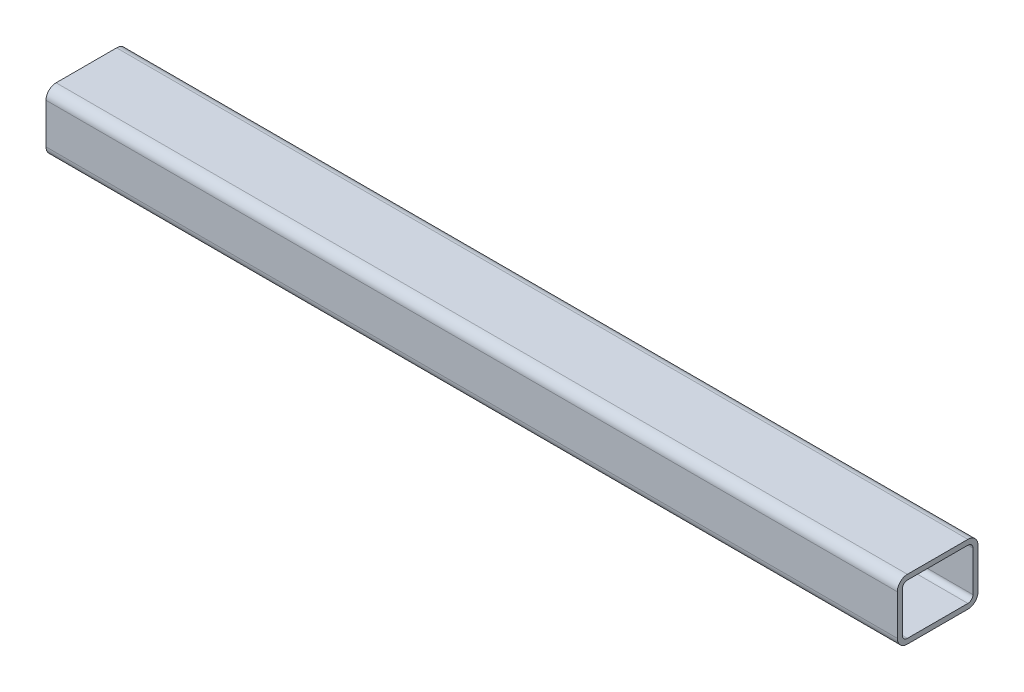
ISO-10303-21;
HEADER;
FILE_DESCRIPTION(('STEP AP214'),'2;1');
FILE_NAME('part.step','',(''),(''),'','','');
FILE_SCHEMA(('AUTOMOTIVE_DESIGN { 1 0 10303 214 1 1 1 1 }'));
ENDSEC;
DATA;
#1=APPLICATION_CONTEXT('core data for automotive mechanical design processes');
#2=APPLICATION_PROTOCOL_DEFINITION('international standard','automotive_design',2000,#1);
#3=PRODUCT_CONTEXT('',#1,'mechanical');
#4=PRODUCT('Part','Part','',(#3));
#5=PRODUCT_RELATED_PRODUCT_CATEGORY('part','',(#4));
#6=PRODUCT_DEFINITION_FORMATION('','',#4);
#7=PRODUCT_DEFINITION_CONTEXT('part definition',#1,'design');
#8=PRODUCT_DEFINITION('design','',#6,#7);
#9=PRODUCT_DEFINITION_SHAPE('','',#8);
#10=(LENGTH_UNIT() NAMED_UNIT(*) SI_UNIT(.MILLI.,.METRE.));
#11=(NAMED_UNIT(*) PLANE_ANGLE_UNIT() SI_UNIT($,.RADIAN.));
#12=(NAMED_UNIT(*) SI_UNIT($,.STERADIAN.) SOLID_ANGLE_UNIT());
#13=UNCERTAINTY_MEASURE_WITH_UNIT(LENGTH_MEASURE(1.E-05),#10,'distance_accuracy_value','');
#14=(GEOMETRIC_REPRESENTATION_CONTEXT(3) GLOBAL_UNCERTAINTY_ASSIGNED_CONTEXT((#13)) GLOBAL_UNIT_ASSIGNED_CONTEXT((#10,
#11,#12)) REPRESENTATION_CONTEXT('',''));
#15=CARTESIAN_POINT('',(0.,0.,0.));
#16=DIRECTION('',(0.,0.,1.));
#17=DIRECTION('',(1.,0.,0.));
#18=AXIS2_PLACEMENT_3D('',#15,#16,#17);
#19=CARTESIAN_POINT('',(422.,-20.,30.));
#20=DIRECTION('',(1.,0.,0.));
#21=DIRECTION('',(0.,0.,-1.));
#22=AXIS2_PLACEMENT_3D('',#19,#20,#21);
#23=PLANE('',#22);
#24=CARTESIAN_POINT('',(422.,-20.,30.));
#25=DIRECTION('',(1.,0.,0.));
#26=DIRECTION('',(0.,0.,-1.));
#27=AXIS2_PLACEMENT_3D('',#24,#25,#26);
#28=CIRCLE('',#27,10.);
#29=CARTESIAN_POINT('',(422.,-20.,40.));
#30=VERTEX_POINT('',#29);
#31=CARTESIAN_POINT('',(422.,-30.,30.));
#32=VERTEX_POINT('',#31);
#33=EDGE_CURVE('E212',#30,#32,#28,.T.);
#34=ORIENTED_EDGE('',*,*,#33,.T.);
#35=DIRECTION('',(0.,0.,-1.));
#36=VECTOR('',#35,1.);
#37=CARTESIAN_POINT('',(422.,-30.,30.));
#38=LINE('',#37,#36);
#39=CARTESIAN_POINT('',(422.,-30.,-30.));
#40=VERTEX_POINT('',#39);
#41=EDGE_CURVE('E215',#32,#40,#38,.T.);
#42=ORIENTED_EDGE('',*,*,#41,.T.);
#43=CARTESIAN_POINT('',(422.,-20.,-30.));
#44=DIRECTION('',(1.,0.,0.));
#45=DIRECTION('',(0.,0.,-1.));
#46=AXIS2_PLACEMENT_3D('',#43,#44,#45);
#47=CIRCLE('',#46,10.);
#48=CARTESIAN_POINT('',(422.,-20.,-40.));
#49=VERTEX_POINT('',#48);
#50=EDGE_CURVE('E218',#40,#49,#47,.T.);
#51=ORIENTED_EDGE('',*,*,#50,.T.);
#52=DIRECTION('',(0.,1.,0.));
#53=VECTOR('',#52,1.);
#54=CARTESIAN_POINT('',(422.,20.,-40.));
#55=LINE('',#54,#53);
#56=CARTESIAN_POINT('',(422.,20.,-40.));
#57=VERTEX_POINT('',#56);
#58=EDGE_CURVE('E220',#49,#57,#55,.T.);
#59=ORIENTED_EDGE('',*,*,#58,.T.);
#60=CARTESIAN_POINT('',(422.,20.,-30.));
#61=DIRECTION('',(1.,0.,0.));
#62=DIRECTION('',(0.,0.,1.));
#63=AXIS2_PLACEMENT_3D('',#60,#61,#62);
#64=CIRCLE('',#63,10.);
#65=CARTESIAN_POINT('',(422.,30.,-30.));
#66=VERTEX_POINT('',#65);
#67=EDGE_CURVE('E222',#57,#66,#64,.T.);
#68=ORIENTED_EDGE('',*,*,#67,.T.);
#69=DIRECTION('',(0.,0.,1.));
#70=VECTOR('',#69,1.);
#71=CARTESIAN_POINT('',(422.,30.,30.));
#72=LINE('',#71,#70);
#73=CARTESIAN_POINT('',(422.,30.,30.));
#74=VERTEX_POINT('',#73);
#75=EDGE_CURVE('E224',#66,#74,#72,.T.);
#76=ORIENTED_EDGE('',*,*,#75,.T.);
#77=CARTESIAN_POINT('',(422.,20.,30.));
#78=DIRECTION('',(1.,0.,0.));
#79=DIRECTION('',(0.,0.,-1.));
#80=AXIS2_PLACEMENT_3D('',#77,#78,#79);
#81=CIRCLE('',#80,10.);
#82=CARTESIAN_POINT('',(422.,20.,40.));
#83=VERTEX_POINT('',#82);
#84=EDGE_CURVE('E226',#74,#83,#81,.T.);
#85=ORIENTED_EDGE('',*,*,#84,.T.);
#86=DIRECTION('',(0.,-1.,0.));
#87=VECTOR('',#86,1.);
#88=CARTESIAN_POINT('',(422.,20.,40.));
#89=LINE('',#88,#87);
#90=EDGE_CURVE('E228',#83,#30,#89,.T.);
#91=ORIENTED_EDGE('',*,*,#90,.T.);
#92=EDGE_LOOP('',(#34,#42,#51,#59,#68,#76,#85,#91));
#93=FACE_BOUND('',#92,.T.);
#94=DIRECTION('',(0.,0.,-1.));
#95=VECTOR('',#94,1.);
#96=CARTESIAN_POINT('',(422.,-25.,30.));
#97=LINE('',#96,#95);
#98=CARTESIAN_POINT('',(422.,-25.,30.));
#99=VERTEX_POINT('',#98);
#100=CARTESIAN_POINT('',(422.,-25.,-30.));
#101=VERTEX_POINT('',#100);
#102=EDGE_CURVE('E155',#99,#101,#97,.T.);
#103=ORIENTED_EDGE('',*,*,#102,.F.);
#104=CARTESIAN_POINT('',(422.,-20.,30.));
#105=DIRECTION('',(1.,0.,0.));
#106=DIRECTION('',(0.,0.,1.));
#107=AXIS2_PLACEMENT_3D('',#104,#105,#106);
#108=CIRCLE('',#107,5.00000000000001);
#109=CARTESIAN_POINT('',(422.,-20.,35.));
#110=VERTEX_POINT('',#109);
#111=EDGE_CURVE('E147',#110,#99,#108,.T.);
#112=ORIENTED_EDGE('',*,*,#111,.F.);
#113=DIRECTION('',(0.,-1.,0.));
#114=VECTOR('',#113,1.);
#115=CARTESIAN_POINT('',(422.,20.,35.));
#116=LINE('',#115,#114);
#117=CARTESIAN_POINT('',(422.,20.,35.));
#118=VERTEX_POINT('',#117);
#119=EDGE_CURVE('E180',#118,#110,#116,.T.);
#120=ORIENTED_EDGE('',*,*,#119,.F.);
#121=CARTESIAN_POINT('',(422.,20.,30.));
#122=DIRECTION('',(1.,0.,0.));
#123=DIRECTION('',(0.,0.,-1.));
#124=AXIS2_PLACEMENT_3D('',#121,#122,#123);
#125=CIRCLE('',#124,5.);
#126=CARTESIAN_POINT('',(422.,25.,30.));
#127=VERTEX_POINT('',#126);
#128=EDGE_CURVE('E178',#127,#118,#125,.T.);
#129=ORIENTED_EDGE('',*,*,#128,.F.);
#130=DIRECTION('',(0.,0.,1.));
#131=VECTOR('',#130,1.);
#132=CARTESIAN_POINT('',(422.,25.,30.));
#133=LINE('',#132,#131);
#134=CARTESIAN_POINT('',(422.,25.,-30.));
#135=VERTEX_POINT('',#134);
#136=EDGE_CURVE('E176',#135,#127,#133,.T.);
#137=ORIENTED_EDGE('',*,*,#136,.F.);
#138=CARTESIAN_POINT('',(422.,20.,-30.));
#139=DIRECTION('',(1.,0.,0.));
#140=DIRECTION('',(0.,0.,1.));
#141=AXIS2_PLACEMENT_3D('',#138,#139,#140);
#142=CIRCLE('',#141,5.00000000000001);
#143=CARTESIAN_POINT('',(422.,20.,-35.));
#144=VERTEX_POINT('',#143);
#145=EDGE_CURVE('E174',#144,#135,#142,.T.);
#146=ORIENTED_EDGE('',*,*,#145,.F.);
#147=DIRECTION('',(0.,1.,0.));
#148=VECTOR('',#147,1.);
#149=CARTESIAN_POINT('',(422.,20.,-35.));
#150=LINE('',#149,#148);
#151=CARTESIAN_POINT('',(422.,-20.,-35.));
#152=VERTEX_POINT('',#151);
#153=EDGE_CURVE('E170',#152,#144,#150,.T.);
#154=ORIENTED_EDGE('',*,*,#153,.F.);
#155=CARTESIAN_POINT('',(422.,-20.,-30.));
#156=DIRECTION('',(1.,0.,0.));
#157=DIRECTION('',(0.,0.,1.));
#158=AXIS2_PLACEMENT_3D('',#155,#156,#157);
#159=CIRCLE('',#158,5.00000000000001);
#160=EDGE_CURVE('E168',#101,#152,#159,.T.);
#161=ORIENTED_EDGE('',*,*,#160,.F.);
#162=EDGE_LOOP('',(#103,#112,#120,#129,#137,#146,#154,#161));
#163=FACE_BOUND('',#162,.T.);
#164=ADVANCED_FACE('F34',(#93,#163),#23,.T.);
#165=CARTESIAN_POINT('',(-422.,-20.,30.));
#166=DIRECTION('',(1.,0.,0.));
#167=DIRECTION('',(0.,0.,-1.));
#168=AXIS2_PLACEMENT_3D('',#165,#166,#167);
#169=PLANE('',#168);
#170=CARTESIAN_POINT('',(-422.,-20.,30.));
#171=DIRECTION('',(1.,0.,0.));
#172=DIRECTION('',(0.,0.,-1.));
#173=AXIS2_PLACEMENT_3D('',#170,#171,#172);
#174=CIRCLE('',#173,10.);
#175=CARTESIAN_POINT('',(-422.,-20.,40.));
#176=VERTEX_POINT('',#175);
#177=CARTESIAN_POINT('',(-422.,-30.,30.));
#178=VERTEX_POINT('',#177);
#179=EDGE_CURVE('E163',#176,#178,#174,.T.);
#180=ORIENTED_EDGE('',*,*,#179,.F.);
#181=DIRECTION('',(0.,-1.,0.));
#182=VECTOR('',#181,1.);
#183=CARTESIAN_POINT('',(-422.,20.,40.));
#184=LINE('',#183,#182);
#185=CARTESIAN_POINT('',(-422.,20.,40.));
#186=VERTEX_POINT('',#185);
#187=EDGE_CURVE('E216',#186,#176,#184,.T.);
#188=ORIENTED_EDGE('',*,*,#187,.F.);
#189=CARTESIAN_POINT('',(-422.,20.,30.));
#190=DIRECTION('',(1.,0.,0.));
#191=DIRECTION('',(0.,0.,-1.));
#192=AXIS2_PLACEMENT_3D('',#189,#190,#191);
#193=CIRCLE('',#192,10.);
#194=CARTESIAN_POINT('',(-422.,30.,30.));
#195=VERTEX_POINT('',#194);
#196=EDGE_CURVE('E243',#195,#186,#193,.T.);
#197=ORIENTED_EDGE('',*,*,#196,.F.);
#198=DIRECTION('',(0.,0.,1.));
#199=VECTOR('',#198,1.);
#200=CARTESIAN_POINT('',(-422.,30.,30.));
#201=LINE('',#200,#199);
#202=CARTESIAN_POINT('',(-422.,30.,-30.));
#203=VERTEX_POINT('',#202);
#204=EDGE_CURVE('E241',#203,#195,#201,.T.);
#205=ORIENTED_EDGE('',*,*,#204,.F.);
#206=CARTESIAN_POINT('',(-422.,20.,-30.));
#207=DIRECTION('',(1.,0.,0.));
#208=DIRECTION('',(0.,0.,1.));
#209=AXIS2_PLACEMENT_3D('',#206,#207,#208);
#210=CIRCLE('',#209,10.);
#211=CARTESIAN_POINT('',(-422.,20.,-40.));
#212=VERTEX_POINT('',#211);
#213=EDGE_CURVE('E239',#212,#203,#210,.T.);
#214=ORIENTED_EDGE('',*,*,#213,.F.);
#215=DIRECTION('',(0.,1.,0.));
#216=VECTOR('',#215,1.);
#217=CARTESIAN_POINT('',(-422.,20.,-40.));
#218=LINE('',#217,#216);
#219=CARTESIAN_POINT('',(-422.,-20.,-40.));
#220=VERTEX_POINT('',#219);
#221=EDGE_CURVE('E237',#220,#212,#218,.T.);
#222=ORIENTED_EDGE('',*,*,#221,.F.);
#223=CARTESIAN_POINT('',(-422.,-20.,-30.));
#224=DIRECTION('',(1.,0.,0.));
#225=DIRECTION('',(0.,0.,-1.));
#226=AXIS2_PLACEMENT_3D('',#223,#224,#225);
#227=CIRCLE('',#226,10.);
#228=CARTESIAN_POINT('',(-422.,-30.,-30.));
#229=VERTEX_POINT('',#228);
#230=EDGE_CURVE('E235',#229,#220,#227,.T.);
#231=ORIENTED_EDGE('',*,*,#230,.F.);
#232=DIRECTION('',(0.,0.,-1.));
#233=VECTOR('',#232,1.);
#234=CARTESIAN_POINT('',(-422.,-30.,30.));
#235=LINE('',#234,#233);
#236=EDGE_CURVE('E233',#178,#229,#235,.T.);
#237=ORIENTED_EDGE('',*,*,#236,.F.);
#238=EDGE_LOOP('',(#180,#188,#197,#205,#214,#222,#231,#237));
#239=FACE_BOUND('',#238,.T.);
#240=CARTESIAN_POINT('',(-422.,-20.,30.));
#241=DIRECTION('',(1.,0.,0.));
#242=DIRECTION('',(0.,0.,1.));
#243=AXIS2_PLACEMENT_3D('',#240,#241,#242);
#244=CIRCLE('',#243,5.00000000000001);
#245=CARTESIAN_POINT('',(-422.,-20.,35.));
#246=VERTEX_POINT('',#245);
#247=CARTESIAN_POINT('',(-422.,-25.,30.));
#248=VERTEX_POINT('',#247);
#249=EDGE_CURVE('E57',#246,#248,#244,.T.);
#250=ORIENTED_EDGE('',*,*,#249,.T.);
#251=DIRECTION('',(0.,0.,-1.));
#252=VECTOR('',#251,1.);
#253=CARTESIAN_POINT('',(-422.,-25.,30.));
#254=LINE('',#253,#252);
#255=CARTESIAN_POINT('',(-422.,-25.,-30.));
#256=VERTEX_POINT('',#255);
#257=EDGE_CURVE('E162',#248,#256,#254,.T.);
#258=ORIENTED_EDGE('',*,*,#257,.T.);
#259=CARTESIAN_POINT('',(-422.,-20.,-30.));
#260=DIRECTION('',(1.,0.,0.));
#261=DIRECTION('',(0.,0.,1.));
#262=AXIS2_PLACEMENT_3D('',#259,#260,#261);
#263=CIRCLE('',#262,5.00000000000001);
#264=CARTESIAN_POINT('',(-422.,-20.,-35.));
#265=VERTEX_POINT('',#264);
#266=EDGE_CURVE('E184',#256,#265,#263,.T.);
#267=ORIENTED_EDGE('',*,*,#266,.T.);
#268=DIRECTION('',(0.,1.,0.));
#269=VECTOR('',#268,1.);
#270=CARTESIAN_POINT('',(-422.,20.,-35.));
#271=LINE('',#270,#269);
#272=CARTESIAN_POINT('',(-422.,20.,-35.));
#273=VERTEX_POINT('',#272);
#274=EDGE_CURVE('E187',#265,#273,#271,.T.);
#275=ORIENTED_EDGE('',*,*,#274,.T.);
#276=CARTESIAN_POINT('',(-422.,20.,-30.));
#277=DIRECTION('',(1.,0.,0.));
#278=DIRECTION('',(0.,0.,1.));
#279=AXIS2_PLACEMENT_3D('',#276,#277,#278);
#280=CIRCLE('',#279,5.00000000000001);
#281=CARTESIAN_POINT('',(-422.,25.,-30.));
#282=VERTEX_POINT('',#281);
#283=EDGE_CURVE('E190',#273,#282,#280,.T.);
#284=ORIENTED_EDGE('',*,*,#283,.T.);
#285=DIRECTION('',(0.,0.,1.));
#286=VECTOR('',#285,1.);
#287=CARTESIAN_POINT('',(-422.,25.,30.));
#288=LINE('',#287,#286);
#289=CARTESIAN_POINT('',(-422.,25.,30.));
#290=VERTEX_POINT('',#289);
#291=EDGE_CURVE('E193',#282,#290,#288,.T.);
#292=ORIENTED_EDGE('',*,*,#291,.T.);
#293=CARTESIAN_POINT('',(-422.,20.,30.));
#294=DIRECTION('',(1.,0.,0.));
#295=DIRECTION('',(0.,0.,-1.));
#296=AXIS2_PLACEMENT_3D('',#293,#294,#295);
#297=CIRCLE('',#296,5.);
#298=CARTESIAN_POINT('',(-422.,20.,35.));
#299=VERTEX_POINT('',#298);
#300=EDGE_CURVE('E196',#290,#299,#297,.T.);
#301=ORIENTED_EDGE('',*,*,#300,.T.);
#302=DIRECTION('',(0.,-1.,0.));
#303=VECTOR('',#302,1.);
#304=CARTESIAN_POINT('',(-422.,20.,35.));
#305=LINE('',#304,#303);
#306=EDGE_CURVE('E156',#299,#246,#305,.T.);
#307=ORIENTED_EDGE('',*,*,#306,.T.);
#308=EDGE_LOOP('',(#250,#258,#267,#275,#284,#292,#301,#307));
#309=FACE_BOUND('',#308,.T.);
#310=ADVANCED_FACE('F273',(#239,#309),#169,.F.);
#311=CARTESIAN_POINT('',(422.,-20.,30.));
#312=DIRECTION('',(-1.,0.,0.));
#313=DIRECTION('',(0.,0.,1.));
#314=AXIS2_PLACEMENT_3D('',#311,#312,#313);
#315=CYLINDRICAL_SURFACE('',#314,10.);
#316=ORIENTED_EDGE('',*,*,#179,.T.);
#317=DIRECTION('',(-1.,0.,0.));
#318=VECTOR('',#317,1.);
#319=CARTESIAN_POINT('',(422.,-30.,30.));
#320=LINE('',#319,#318);
#321=EDGE_CURVE('E11',#32,#178,#320,.T.);
#322=ORIENTED_EDGE('',*,*,#321,.F.);
#323=ORIENTED_EDGE('',*,*,#33,.F.);
#324=DIRECTION('',(-1.,0.,0.));
#325=VECTOR('',#324,1.);
#326=CARTESIAN_POINT('',(422.,-20.,40.));
#327=LINE('',#326,#325);
#328=EDGE_CURVE('E230',#30,#176,#327,.T.);
#329=ORIENTED_EDGE('',*,*,#328,.T.);
#330=EDGE_LOOP('',(#316,#322,#323,#329));
#331=FACE_BOUND('',#330,.T.);
#332=ADVANCED_FACE('F36',(#331),#315,.T.);
#333=CARTESIAN_POINT('',(422.,-30.,30.));
#334=DIRECTION('',(0.,1.,0.));
#335=DIRECTION('',(0.,0.,1.));
#336=AXIS2_PLACEMENT_3D('',#333,#334,#335);
#337=PLANE('',#336);
#338=ORIENTED_EDGE('',*,*,#236,.T.);
#339=DIRECTION('',(-1.,0.,0.));
#340=VECTOR('',#339,1.);
#341=CARTESIAN_POINT('',(422.,-30.,-30.));
#342=LINE('',#341,#340);
#343=EDGE_CURVE('E42',#40,#229,#342,.T.);
#344=ORIENTED_EDGE('',*,*,#343,.F.);
#345=ORIENTED_EDGE('',*,*,#41,.F.);
#346=ORIENTED_EDGE('',*,*,#321,.T.);
#347=EDGE_LOOP('',(#338,#344,#345,#346));
#348=FACE_BOUND('',#347,.T.);
#349=ADVANCED_FACE('F290',(#348),#337,.F.);
#350=CARTESIAN_POINT('',(422.,-20.,-30.));
#351=DIRECTION('',(-1.,0.,0.));
#352=DIRECTION('',(0.,0.,1.));
#353=AXIS2_PLACEMENT_3D('',#350,#351,#352);
#354=CYLINDRICAL_SURFACE('',#353,10.);
#355=ORIENTED_EDGE('',*,*,#230,.T.);
#356=DIRECTION('',(-1.,0.,0.));
#357=VECTOR('',#356,1.);
#358=CARTESIAN_POINT('',(422.,-20.,-40.));
#359=LINE('',#358,#357);
#360=EDGE_CURVE('E260',#49,#220,#359,.T.);
#361=ORIENTED_EDGE('',*,*,#360,.F.);
#362=ORIENTED_EDGE('',*,*,#50,.F.);
#363=ORIENTED_EDGE('',*,*,#343,.T.);
#364=EDGE_LOOP('',(#355,#361,#362,#363));
#365=FACE_BOUND('',#364,.T.);
#366=ADVANCED_FACE('F267',(#365),#354,.T.);
#367=CARTESIAN_POINT('',(422.,20.,-40.));
#368=DIRECTION('',(0.,0.,1.));
#369=DIRECTION('',(1.,0.,0.));
#370=AXIS2_PLACEMENT_3D('',#367,#368,#369);
#371=PLANE('',#370);
#372=ORIENTED_EDGE('',*,*,#221,.T.);
#373=DIRECTION('',(-1.,0.,0.));
#374=VECTOR('',#373,1.);
#375=CARTESIAN_POINT('',(422.,20.,-40.));
#376=LINE('',#375,#374);
#377=EDGE_CURVE('E257',#57,#212,#376,.T.);
#378=ORIENTED_EDGE('',*,*,#377,.F.);
#379=ORIENTED_EDGE('',*,*,#58,.F.);
#380=ORIENTED_EDGE('',*,*,#360,.T.);
#381=EDGE_LOOP('',(#372,#378,#379,#380));
#382=FACE_BOUND('',#381,.T.);
#383=ADVANCED_FACE('F279',(#382),#371,.F.);
#384=CARTESIAN_POINT('',(422.,20.,-30.));
#385=DIRECTION('',(-1.,0.,0.));
#386=DIRECTION('',(0.,0.,1.));
#387=AXIS2_PLACEMENT_3D('',#384,#385,#386);
#388=CYLINDRICAL_SURFACE('',#387,10.);
#389=ORIENTED_EDGE('',*,*,#213,.T.);
#390=DIRECTION('',(-1.,0.,0.));
#391=VECTOR('',#390,1.);
#392=CARTESIAN_POINT('',(422.,30.,-30.));
#393=LINE('',#392,#391);
#394=EDGE_CURVE('E254',#66,#203,#393,.T.);
#395=ORIENTED_EDGE('',*,*,#394,.F.);
#396=ORIENTED_EDGE('',*,*,#67,.F.);
#397=ORIENTED_EDGE('',*,*,#377,.T.);
#398=EDGE_LOOP('',(#389,#395,#396,#397));
#399=FACE_BOUND('',#398,.T.);
#400=ADVANCED_FACE('F283',(#399),#388,.T.);
#401=CARTESIAN_POINT('',(422.,30.,30.));
#402=DIRECTION('',(0.,-1.,0.));
#403=DIRECTION('',(0.,0.,-1.));
#404=AXIS2_PLACEMENT_3D('',#401,#402,#403);
#405=PLANE('',#404);
#406=ORIENTED_EDGE('',*,*,#204,.T.);
#407=DIRECTION('',(-1.,0.,0.));
#408=VECTOR('',#407,1.);
#409=CARTESIAN_POINT('',(422.,30.,30.));
#410=LINE('',#409,#408);
#411=EDGE_CURVE('E251',#74,#195,#410,.T.);
#412=ORIENTED_EDGE('',*,*,#411,.F.);
#413=ORIENTED_EDGE('',*,*,#75,.F.);
#414=ORIENTED_EDGE('',*,*,#394,.T.);
#415=EDGE_LOOP('',(#406,#412,#413,#414));
#416=FACE_BOUND('',#415,.T.);
#417=ADVANCED_FACE('F303',(#416),#405,.F.);
#418=CARTESIAN_POINT('',(422.,20.,30.));
#419=DIRECTION('',(-1.,0.,0.));
#420=DIRECTION('',(0.,0.,1.));
#421=AXIS2_PLACEMENT_3D('',#418,#419,#420);
#422=CYLINDRICAL_SURFACE('',#421,10.);
#423=ORIENTED_EDGE('',*,*,#196,.T.);
#424=DIRECTION('',(-1.,0.,0.));
#425=VECTOR('',#424,1.);
#426=CARTESIAN_POINT('',(422.,20.,40.));
#427=LINE('',#426,#425);
#428=EDGE_CURVE('E248',#83,#186,#427,.T.);
#429=ORIENTED_EDGE('',*,*,#428,.F.);
#430=ORIENTED_EDGE('',*,*,#84,.F.);
#431=ORIENTED_EDGE('',*,*,#411,.T.);
#432=EDGE_LOOP('',(#423,#429,#430,#431));
#433=FACE_BOUND('',#432,.T.);
#434=ADVANCED_FACE('F301',(#433),#422,.T.);
#435=CARTESIAN_POINT('',(422.,20.,40.));
#436=DIRECTION('',(0.,0.,-1.));
#437=DIRECTION('',(-1.,0.,0.));
#438=AXIS2_PLACEMENT_3D('',#435,#436,#437);
#439=PLANE('',#438);
#440=ORIENTED_EDGE('',*,*,#187,.T.);
#441=ORIENTED_EDGE('',*,*,#328,.F.);
#442=ORIENTED_EDGE('',*,*,#90,.F.);
#443=ORIENTED_EDGE('',*,*,#428,.T.);
#444=EDGE_LOOP('',(#440,#441,#442,#443));
#445=FACE_BOUND('',#444,.T.);
#446=ADVANCED_FACE('F296',(#445),#439,.F.);
#447=CARTESIAN_POINT('',(422.,-20.,30.));
#448=DIRECTION('',(-1.,0.,0.));
#449=DIRECTION('',(0.,0.,1.));
#450=AXIS2_PLACEMENT_3D('',#447,#448,#449);
#451=CYLINDRICAL_SURFACE('',#450,5.00000000000001);
#452=ORIENTED_EDGE('',*,*,#249,.F.);
#453=DIRECTION('',(-1.,0.,0.));
#454=VECTOR('',#453,1.);
#455=CARTESIAN_POINT('',(422.,-20.,35.));
#456=LINE('',#455,#454);
#457=EDGE_CURVE('E151',#110,#246,#456,.T.);
#458=ORIENTED_EDGE('',*,*,#457,.F.);
#459=ORIENTED_EDGE('',*,*,#111,.T.);
#460=DIRECTION('',(-1.,0.,0.));
#461=VECTOR('',#460,1.);
#462=CARTESIAN_POINT('',(422.,-25.,30.));
#463=LINE('',#462,#461);
#464=EDGE_CURVE('E150',#99,#248,#463,.T.);
#465=ORIENTED_EDGE('',*,*,#464,.T.);
#466=EDGE_LOOP('',(#452,#458,#459,#465));
#467=FACE_BOUND('',#466,.T.);
#468=ADVANCED_FACE('F149',(#467),#451,.F.);
#469=CARTESIAN_POINT('',(422.,-25.,30.));
#470=DIRECTION('',(0.,1.,0.));
#471=DIRECTION('',(0.,0.,1.));
#472=AXIS2_PLACEMENT_3D('',#469,#470,#471);
#473=PLANE('',#472);
#474=ORIENTED_EDGE('',*,*,#257,.F.);
#475=ORIENTED_EDGE('',*,*,#464,.F.);
#476=ORIENTED_EDGE('',*,*,#102,.T.);
#477=DIRECTION('',(-1.,0.,0.));
#478=VECTOR('',#477,1.);
#479=CARTESIAN_POINT('',(422.,-25.,-30.));
#480=LINE('',#479,#478);
#481=EDGE_CURVE('E164',#101,#256,#480,.T.);
#482=ORIENTED_EDGE('',*,*,#481,.T.);
#483=EDGE_LOOP('',(#474,#475,#476,#482));
#484=FACE_BOUND('',#483,.T.);
#485=ADVANCED_FACE('F159',(#484),#473,.T.);
#486=CARTESIAN_POINT('',(422.,-20.,-30.));
#487=DIRECTION('',(-1.,0.,0.));
#488=DIRECTION('',(0.,0.,1.));
#489=AXIS2_PLACEMENT_3D('',#486,#487,#488);
#490=CYLINDRICAL_SURFACE('',#489,5.00000000000001);
#491=ORIENTED_EDGE('',*,*,#266,.F.);
#492=ORIENTED_EDGE('',*,*,#481,.F.);
#493=ORIENTED_EDGE('',*,*,#160,.T.);
#494=DIRECTION('',(-1.,0.,0.));
#495=VECTOR('',#494,1.);
#496=CARTESIAN_POINT('',(422.,-20.,-35.));
#497=LINE('',#496,#495);
#498=EDGE_CURVE('E209',#152,#265,#497,.T.);
#499=ORIENTED_EDGE('',*,*,#498,.T.);
#500=EDGE_LOOP('',(#491,#492,#493,#499));
#501=FACE_BOUND('',#500,.T.);
#502=ADVANCED_FACE('F328',(#501),#490,.F.);
#503=CARTESIAN_POINT('',(422.,20.,-35.));
#504=DIRECTION('',(0.,0.,1.));
#505=DIRECTION('',(1.,0.,0.));
#506=AXIS2_PLACEMENT_3D('',#503,#504,#505);
#507=PLANE('',#506);
#508=ORIENTED_EDGE('',*,*,#274,.F.);
#509=ORIENTED_EDGE('',*,*,#498,.F.);
#510=ORIENTED_EDGE('',*,*,#153,.T.);
#511=DIRECTION('',(-1.,0.,0.));
#512=VECTOR('',#511,1.);
#513=CARTESIAN_POINT('',(422.,20.,-35.));
#514=LINE('',#513,#512);
#515=EDGE_CURVE('E207',#144,#273,#514,.T.);
#516=ORIENTED_EDGE('',*,*,#515,.T.);
#517=EDGE_LOOP('',(#508,#509,#510,#516));
#518=FACE_BOUND('',#517,.T.);
#519=ADVANCED_FACE('F332',(#518),#507,.T.);
#520=CARTESIAN_POINT('',(422.,20.,-30.));
#521=DIRECTION('',(-1.,0.,0.));
#522=DIRECTION('',(0.,0.,1.));
#523=AXIS2_PLACEMENT_3D('',#520,#521,#522);
#524=CYLINDRICAL_SURFACE('',#523,5.00000000000001);
#525=ORIENTED_EDGE('',*,*,#283,.F.);
#526=ORIENTED_EDGE('',*,*,#515,.F.);
#527=ORIENTED_EDGE('',*,*,#145,.T.);
#528=DIRECTION('',(-1.,0.,0.));
#529=VECTOR('',#528,1.);
#530=CARTESIAN_POINT('',(422.,25.,-30.));
#531=LINE('',#530,#529);
#532=EDGE_CURVE('E205',#135,#282,#531,.T.);
#533=ORIENTED_EDGE('',*,*,#532,.T.);
#534=EDGE_LOOP('',(#525,#526,#527,#533));
#535=FACE_BOUND('',#534,.T.);
#536=ADVANCED_FACE('F338',(#535),#524,.F.);
#537=CARTESIAN_POINT('',(422.,25.,30.));
#538=DIRECTION('',(0.,-1.,0.));
#539=DIRECTION('',(0.,0.,-1.));
#540=AXIS2_PLACEMENT_3D('',#537,#538,#539);
#541=PLANE('',#540);
#542=ORIENTED_EDGE('',*,*,#291,.F.);
#543=ORIENTED_EDGE('',*,*,#532,.F.);
#544=ORIENTED_EDGE('',*,*,#136,.T.);
#545=DIRECTION('',(-1.,0.,0.));
#546=VECTOR('',#545,1.);
#547=CARTESIAN_POINT('',(422.,25.,30.));
#548=LINE('',#547,#546);
#549=EDGE_CURVE('E203',#127,#290,#548,.T.);
#550=ORIENTED_EDGE('',*,*,#549,.T.);
#551=EDGE_LOOP('',(#542,#543,#544,#550));
#552=FACE_BOUND('',#551,.T.);
#553=ADVANCED_FACE('F342',(#552),#541,.T.);
#554=CARTESIAN_POINT('',(422.,20.,30.));
#555=DIRECTION('',(-1.,0.,0.));
#556=DIRECTION('',(0.,0.,1.));
#557=AXIS2_PLACEMENT_3D('',#554,#555,#556);
#558=CYLINDRICAL_SURFACE('',#557,5.);
#559=ORIENTED_EDGE('',*,*,#300,.F.);
#560=ORIENTED_EDGE('',*,*,#549,.F.);
#561=ORIENTED_EDGE('',*,*,#128,.T.);
#562=DIRECTION('',(-1.,0.,0.));
#563=VECTOR('',#562,1.);
#564=CARTESIAN_POINT('',(422.,20.,35.));
#565=LINE('',#564,#563);
#566=EDGE_CURVE('E49',#118,#299,#565,.T.);
#567=ORIENTED_EDGE('',*,*,#566,.T.);
#568=EDGE_LOOP('',(#559,#560,#561,#567));
#569=FACE_BOUND('',#568,.T.);
#570=ADVANCED_FACE('F346',(#569),#558,.F.);
#571=CARTESIAN_POINT('',(422.,20.,35.));
#572=DIRECTION('',(0.,0.,-1.));
#573=DIRECTION('',(-1.,0.,0.));
#574=AXIS2_PLACEMENT_3D('',#571,#572,#573);
#575=PLANE('',#574);
#576=ORIENTED_EDGE('',*,*,#306,.F.);
#577=ORIENTED_EDGE('',*,*,#566,.F.);
#578=ORIENTED_EDGE('',*,*,#119,.T.);
#579=ORIENTED_EDGE('',*,*,#457,.T.);
#580=EDGE_LOOP('',(#576,#577,#578,#579));
#581=FACE_BOUND('',#580,.T.);
#582=ADVANCED_FACE('F350',(#581),#575,.T.);
#583=CLOSED_SHELL('',(#164,#310,#332,#349,#366,#383,#400,#417,#434,#446,#468,#485,#502,#519,
#536,#553,#570,#582));
#584=MANIFOLD_SOLID_BREP('B2',#583);
#585=ADVANCED_BREP_SHAPE_REPRESENTATION('',(#18,#584),#14);
#586=SHAPE_DEFINITION_REPRESENTATION(#9,#585);
ENDSEC;
END-ISO-10303-21;
